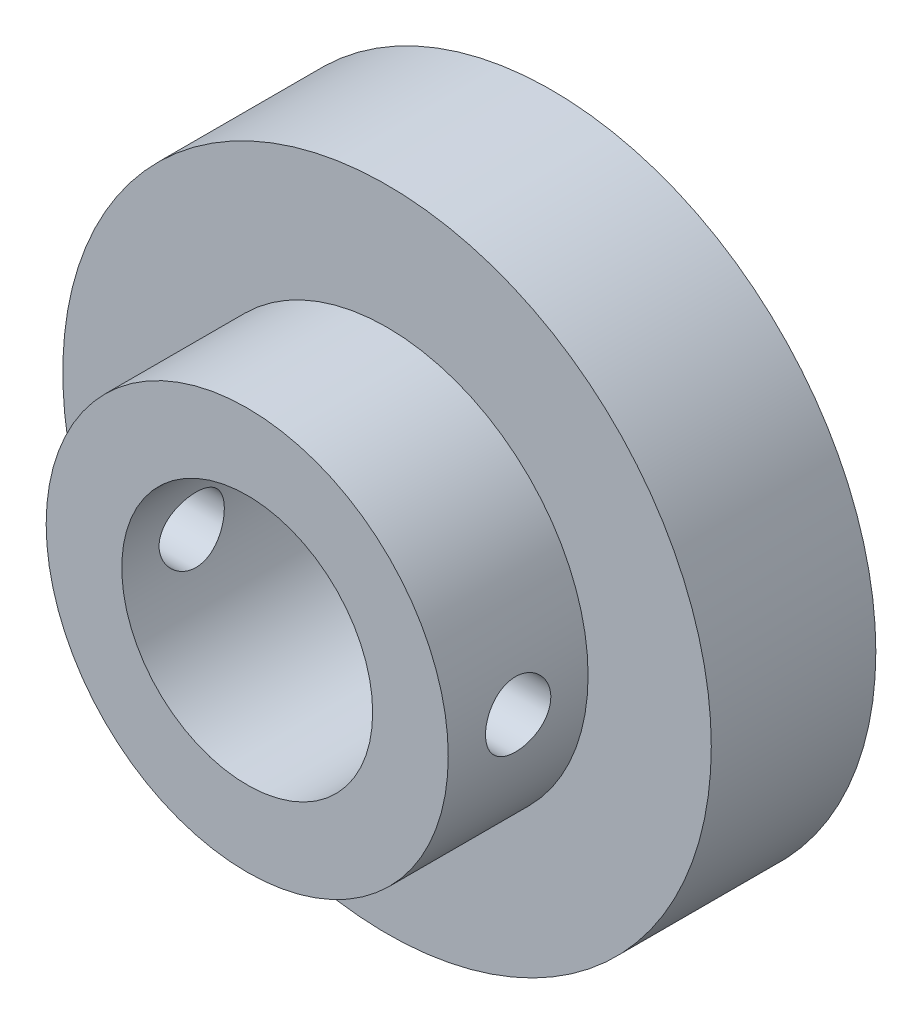
ISO-10303-21;
HEADER;
FILE_DESCRIPTION(('STEP AP214'),'2;1');
FILE_NAME('part.step','',(''),(''),'','','');
FILE_SCHEMA(('AUTOMOTIVE_DESIGN { 1 0 10303 214 1 1 1 1 }'));
ENDSEC;
DATA;
#1=APPLICATION_CONTEXT('core data for automotive mechanical design processes');
#2=APPLICATION_PROTOCOL_DEFINITION('international standard','automotive_design',2000,#1);
#3=PRODUCT_CONTEXT('',#1,'mechanical');
#4=PRODUCT('Part','Part','',(#3));
#5=PRODUCT_RELATED_PRODUCT_CATEGORY('part','',(#4));
#6=PRODUCT_DEFINITION_FORMATION('','',#4);
#7=PRODUCT_DEFINITION_CONTEXT('part definition',#1,'design');
#8=PRODUCT_DEFINITION('design','',#6,#7);
#9=PRODUCT_DEFINITION_SHAPE('','',#8);
#10=(LENGTH_UNIT() NAMED_UNIT(*) SI_UNIT(.MILLI.,.METRE.));
#11=(NAMED_UNIT(*) PLANE_ANGLE_UNIT() SI_UNIT($,.RADIAN.));
#12=(NAMED_UNIT(*) SI_UNIT($,.STERADIAN.) SOLID_ANGLE_UNIT());
#13=UNCERTAINTY_MEASURE_WITH_UNIT(LENGTH_MEASURE(1.E-05),#10,'distance_accuracy_value','');
#14=(GEOMETRIC_REPRESENTATION_CONTEXT(3) GLOBAL_UNCERTAINTY_ASSIGNED_CONTEXT((#13)) GLOBAL_UNIT_ASSIGNED_CONTEXT((#10,
#11,#12)) REPRESENTATION_CONTEXT('',''));
#15=CARTESIAN_POINT('',(0.,0.,0.));
#16=DIRECTION('',(0.,0.,1.));
#17=DIRECTION('',(1.,0.,0.));
#18=AXIS2_PLACEMENT_3D('',#15,#16,#17);
#19=CARTESIAN_POINT('',(0.,0.,10.59));
#20=DIRECTION('',(0.,0.,-1.));
#21=DIRECTION('',(-1.,0.,0.));
#22=AXIS2_PLACEMENT_3D('',#19,#20,#21);
#23=CYLINDRICAL_SURFACE('',#22,20.87);
#24=CARTESIAN_POINT('',(0.,0.,10.59));
#25=DIRECTION('',(0.,0.,1.));
#26=DIRECTION('',(1.,0.,0.));
#27=AXIS2_PLACEMENT_3D('',#24,#25,#26);
#28=CIRCLE('',#27,20.87);
#29=CARTESIAN_POINT('',(20.87,0.,10.59));
#30=VERTEX_POINT('',#29);
#31=EDGE_CURVE('E56',#30,#30,#28,.T.);
#32=ORIENTED_EDGE('',*,*,#31,.F.);
#33=EDGE_LOOP('',(#32));
#34=FACE_BOUND('',#33,.T.);
#35=CARTESIAN_POINT('',(0.,0.,0.));
#36=DIRECTION('',(0.,0.,1.));
#37=DIRECTION('',(1.,0.,0.));
#38=AXIS2_PLACEMENT_3D('',#35,#36,#37);
#39=CIRCLE('',#38,20.87);
#40=CARTESIAN_POINT('',(20.87,0.,0.));
#41=VERTEX_POINT('',#40);
#42=EDGE_CURVE('E62',#41,#41,#39,.T.);
#43=ORIENTED_EDGE('',*,*,#42,.T.);
#44=EDGE_LOOP('',(#43));
#45=FACE_BOUND('',#44,.T.);
#46=ADVANCED_FACE('F43',(#34,#45),#23,.T.);
#47=CARTESIAN_POINT('',(0.,0.,10.59));
#48=DIRECTION('',(0.,0.,1.));
#49=DIRECTION('',(1.,0.,0.));
#50=AXIS2_PLACEMENT_3D('',#47,#48,#49);
#51=PLANE('',#50);
#52=CARTESIAN_POINT('',(0.,0.,10.59));
#53=DIRECTION('',(0.,0.,1.));
#54=DIRECTION('',(1.,0.,0.));
#55=AXIS2_PLACEMENT_3D('',#52,#53,#54);
#56=CIRCLE('',#55,12.94);
#57=CARTESIAN_POINT('',(12.94,0.,10.59));
#58=VERTEX_POINT('',#57);
#59=EDGE_CURVE('E10',#58,#58,#56,.T.);
#60=ORIENTED_EDGE('',*,*,#59,.F.);
#61=EDGE_LOOP('',(#60));
#62=FACE_BOUND('',#61,.T.);
#63=ORIENTED_EDGE('',*,*,#31,.T.);
#64=EDGE_LOOP('',(#63));
#65=FACE_BOUND('',#64,.T.);
#66=ADVANCED_FACE('F112',(#62,#65),#51,.T.);
#67=CARTESIAN_POINT('',(0.,0.,0.));
#68=DIRECTION('',(0.,0.,1.));
#69=DIRECTION('',(1.,0.,0.));
#70=AXIS2_PLACEMENT_3D('',#67,#68,#69);
#71=PLANE('',#70);
#72=CARTESIAN_POINT('',(0.,0.,0.));
#73=DIRECTION('',(0.,0.,1.));
#74=DIRECTION('',(1.,0.,0.));
#75=AXIS2_PLACEMENT_3D('',#72,#73,#74);
#76=CIRCLE('',#75,8.075);
#77=CARTESIAN_POINT('',(8.075,0.,0.));
#78=VERTEX_POINT('',#77);
#79=EDGE_CURVE('E74',#78,#78,#76,.T.);
#80=ORIENTED_EDGE('',*,*,#79,.T.);
#81=EDGE_LOOP('',(#80));
#82=FACE_BOUND('',#81,.T.);
#83=ORIENTED_EDGE('',*,*,#42,.F.);
#84=EDGE_LOOP('',(#83));
#85=FACE_BOUND('',#84,.T.);
#86=ADVANCED_FACE('F110',(#82,#85),#71,.F.);
#87=CARTESIAN_POINT('',(0.,0.,19.59));
#88=DIRECTION('',(0.,0.,-1.));
#89=DIRECTION('',(-1.,0.,0.));
#90=AXIS2_PLACEMENT_3D('',#87,#88,#89);
#91=CYLINDRICAL_SURFACE('',#90,12.94);
#92=CARTESIAN_POINT('',(-12.94,0.,17.19));
#93=CARTESIAN_POINT('',(-12.9399980241754,-0.117133004778793,17.189995264999));
#94=CARTESIAN_POINT('',(-12.9383929722534,-0.234331039595752,17.1801667992868));
#95=CARTESIAN_POINT('',(-12.9321446370873,-0.465443115999579,17.1411272216284));
#96=CARTESIAN_POINT('',(-12.9274985151994,-0.579353985402283,17.1118979999609));
#97=CARTESIAN_POINT('',(-12.9156894358132,-0.800514316461485,17.0349601376974));
#98=CARTESIAN_POINT('',(-12.9085284950729,-0.907769035152397,16.9872663016627));
#99=CARTESIAN_POINT('',(-12.8924782098801,-1.11273907116277,16.8747911383677));
#100=CARTESIAN_POINT('',(-12.8835890746247,-1.21045554093364,16.8100118789502));
#101=CARTESIAN_POINT('',(-12.864978363956,-1.39447740252994,16.6645784214341));
#102=CARTESIAN_POINT('',(-12.8552506088143,-1.48068357233687,16.5837994518265));
#103=CARTESIAN_POINT('',(-12.8361066257887,-1.63838094388958,16.4089281467413));
#104=CARTESIAN_POINT('',(-12.8266904171094,-1.70987123991715,16.3148349924163));
#105=CARTESIAN_POINT('',(-12.8091757961874,-1.83650209178063,16.115328699782));
#106=CARTESIAN_POINT('',(-12.8010853699035,-1.89154510146963,16.009852884709));
#107=CARTESIAN_POINT('',(-12.7872237240288,-1.98309523426999,15.7909994432214));
#108=CARTESIAN_POINT('',(-12.7814523561055,-2.01960354294466,15.6776223227377));
#109=CARTESIAN_POINT('',(-12.7729436015328,-2.07273651696627,15.4472342336656));
#110=CARTESIAN_POINT('',(-12.7701801497652,-2.08953210428434,15.3302636644239));
#111=CARTESIAN_POINT('',(-12.7679211939708,-2.10329269462197,15.0951343916371));
#112=CARTESIAN_POINT('',(-12.7684254706247,-2.10025902851632,14.9769757683618));
#113=CARTESIAN_POINT('',(-12.7726211865325,-2.07458657261038,14.7440411275668));
#114=CARTESIAN_POINT('',(-12.7762814837238,-2.05213933980088,14.6292433555921));
#115=CARTESIAN_POINT('',(-12.7863280972952,-1.98857735786101,14.4050653381095));
#116=CARTESIAN_POINT('',(-12.7927145027339,-1.94746199886199,14.295685269722));
#117=CARTESIAN_POINT('',(-12.8075275939851,-1.84753530331627,14.0848715477765));
#118=CARTESIAN_POINT('',(-12.8159634666115,-1.78864398881776,13.9834764761779));
#119=CARTESIAN_POINT('',(-12.8339185344896,-1.65489392102395,13.7919348555006));
#120=CARTESIAN_POINT('',(-12.8434378127111,-1.58003394442559,13.7017891690369));
#121=CARTESIAN_POINT('',(-12.8626241550442,-1.41542573133163,13.5341960246369));
#122=CARTESIAN_POINT('',(-12.8722916422761,-1.32551304753351,13.4569100424071));
#123=CARTESIAN_POINT('',(-12.8905817017348,-1.1339090523248,13.3184985085741));
#124=CARTESIAN_POINT('',(-12.8992042678604,-1.03221767214673,13.2573730513276));
#125=CARTESIAN_POINT('',(-12.9144442829272,-0.819794336972503,13.153004749562));
#126=CARTESIAN_POINT('',(-12.9210601866165,-0.709055497755941,13.1097756770449));
#127=CARTESIAN_POINT('',(-12.9315289080157,-0.481758135091343,13.0425745253392));
#128=CARTESIAN_POINT('',(-12.9353819447421,-0.365200073725384,13.018600919723));
#129=CARTESIAN_POINT('',(-12.9398614700387,-0.130965202322276,12.9908089840302));
#130=CARTESIAN_POINT('',(-12.940523457129,-0.0133153589305277,12.9867688935482));
#131=CARTESIAN_POINT('',(-12.9386433600402,0.22098059239502,12.9983681586461));
#132=CARTESIAN_POINT('',(-12.9361013925404,0.33762673672501,13.0140067975811));
#133=CARTESIAN_POINT('',(-12.9281209736254,0.565922771244214,13.0643351578607));
#134=CARTESIAN_POINT('',(-12.9226991473034,0.677597391024365,13.0989155660058));
#135=CARTESIAN_POINT('',(-12.9095646260904,0.893564072852798,13.1860296648497));
#136=CARTESIAN_POINT('',(-12.9018518081518,0.997855737995067,13.2385643198815));
#137=CARTESIAN_POINT('',(-12.884903215117,1.19706254963206,13.360606911255));
#138=CARTESIAN_POINT('',(-12.8756551704965,1.29189140758515,13.4302539576811));
#139=CARTESIAN_POINT('',(-12.8567002877048,1.46859452431827,13.5843523195716));
#140=CARTESIAN_POINT('',(-12.8469934180735,1.55046789310391,13.6688046512651));
#141=CARTESIAN_POINT('',(-12.8281007272734,1.69975386288309,13.8511089169434));
#142=CARTESIAN_POINT('',(-12.8189209419045,1.76701694673022,13.949084011271));
#143=CARTESIAN_POINT('',(-12.8022329176678,1.88413012200222,14.1550727666687));
#144=CARTESIAN_POINT('',(-12.7947246278497,1.93398074421829,14.2630861216114));
#145=CARTESIAN_POINT('',(-12.7822745764015,2.01462807907936,14.4856596750184));
#146=CARTESIAN_POINT('',(-12.7773226469574,2.04550037225886,14.6001918933279));
#147=CARTESIAN_POINT('',(-12.7705200655981,2.08755331338758,14.8329030042822));
#148=CARTESIAN_POINT('',(-12.7686691593594,2.09873557617533,14.9510815970679));
#149=CARTESIAN_POINT('',(-12.7682887584011,2.10104779295338,15.1862385501354));
#150=CARTESIAN_POINT('',(-12.7697202937463,2.09241301846941,15.3032146009948));
#151=CARTESIAN_POINT('',(-12.7756582650499,2.05584376184161,15.5340263628907));
#152=CARTESIAN_POINT('',(-12.7801646924999,2.02790933310093,15.6478620826158));
#153=CARTESIAN_POINT('',(-12.7917301988748,1.95362199158984,15.8690778270295));
#154=CARTESIAN_POINT('',(-12.7987866130025,1.90728830150853,15.9764644550541));
#155=CARTESIAN_POINT('',(-12.8146597633533,1.79754161935376,16.1819781793584));
#156=CARTESIAN_POINT('',(-12.8234765794171,1.73412785259065,16.2801048553679));
#157=CARTESIAN_POINT('',(-12.8420011302967,1.59117728489368,16.4655037389089));
#158=CARTESIAN_POINT('',(-12.8517177748315,1.5114670670328,16.5526413624274));
#159=CARTESIAN_POINT('',(-12.8708752011946,1.33855233333814,16.7123852853788));
#160=CARTESIAN_POINT('',(-12.8803159187362,1.24534470246074,16.7849882211368));
#161=CARTESIAN_POINT('',(-12.8979288070116,1.04736093996648,16.914031737696));
#162=CARTESIAN_POINT('',(-12.9060923123139,0.942513394775595,16.9703639374369));
#163=CARTESIAN_POINT('',(-12.9201465303463,0.724756032285155,17.0645307045868));
#164=CARTESIAN_POINT('',(-12.9260395301343,0.611854464339938,17.102383896039));
#165=CARTESIAN_POINT('',(-12.9335865551076,0.415412643898881,17.1502003282046));
#166=CARTESIAN_POINT('',(-12.9359788799252,0.333067652544799,17.1651016034933));
#167=CARTESIAN_POINT('',(-12.9391862949518,0.167159468923981,17.1850030507038));
#168=CARTESIAN_POINT('',(-12.9400014101202,0.0835962959560972,17.1900033793084));
#169=CARTESIAN_POINT('',(-12.94,0.,17.19));
#170=B_SPLINE_CURVE_WITH_KNOTS('',3,(#92,#93,#94,#95,#96,#97,#98,#99,#100,#101,#102,#103,#104,
#105,#106,#107,#108,#109,#110,#111,#112,#113,#114,#115,#116,#117,#118,#119,#120,#121,#122,#123,
#124,#125,#126,#127,#128,#129,#130,#131,#132,#133,#134,#135,#136,#137,#138,#139,#140,#141,#142,
#143,#144,#145,#146,#147,#148,#149,#150,#151,#152,#153,#154,#155,#156,#157,#158,#159,#160,#161,
#162,#163,#164,#165,#166,#167,#168,#169),.UNSPECIFIED.,.T.,.F.,(4,2,2,2,2,2,2,2,2,2,2,2,2,2,2,2,
2,2,2,2,2,2,2,2,2,2,2,2,2,2,2,2,2,2,2,2,2,2,4),(0.,0.351093472911228,0.702515137343853,
1.05365562044774,1.40475362462734,1.75870581788743,2.11267978934147,2.4687132529443,
2.82472394016621,3.17762443121232,3.53050123697217,3.87993536475182,4.22938090900968,
4.58042273393296,4.93149146060019,5.28668111656457,5.64187284633499,5.99733740489108,
6.35277378212674,6.70424687090307,7.05570716037294,7.40516021616641,7.75463204423486,
8.10704467812442,8.45948151096362,8.81537087566218,9.17124939069218,9.52570129150246,
9.88012412129371,10.2303609771512,10.5805968638889,10.9304677991738,11.2803546059946,
11.6341790345009,11.9880852520369,12.3442972031226,12.7001494014687,12.9507241937992,
13.2012950207422),.UNSPECIFIED.);
#171=CARTESIAN_POINT('',(-12.94,0.,17.19));
#172=VERTEX_POINT('',#171);
#173=EDGE_CURVE('E101',#172,#172,#170,.T.);
#174=ORIENTED_EDGE('',*,*,#173,.T.);
#175=EDGE_LOOP('',(#174));
#176=FACE_BOUND('',#175,.T.);
#177=CARTESIAN_POINT('',(12.94,0.,12.99));
#178=CARTESIAN_POINT('',(12.9399980241754,-0.117133004778793,12.990004735001));
#179=CARTESIAN_POINT('',(12.9383929722534,-0.234331039595752,12.9998332007132));
#180=CARTESIAN_POINT('',(12.9321446370873,-0.465443115999579,13.0388727783716));
#181=CARTESIAN_POINT('',(12.9274985151994,-0.579353985402283,13.0681020000391));
#182=CARTESIAN_POINT('',(12.9156894358132,-0.800514316461485,13.1450398623026));
#183=CARTESIAN_POINT('',(12.9085284950729,-0.907769035152396,13.1927336983373));
#184=CARTESIAN_POINT('',(12.8924782098801,-1.11273907116277,13.3052088616323));
#185=CARTESIAN_POINT('',(12.8835890746247,-1.21045554093364,13.3699881210498));
#186=CARTESIAN_POINT('',(12.864978363956,-1.39447740252994,13.5154215785659));
#187=CARTESIAN_POINT('',(12.8552506088143,-1.48068357233687,13.5962005481735));
#188=CARTESIAN_POINT('',(12.8361066257887,-1.63838094388958,13.7710718532587));
#189=CARTESIAN_POINT('',(12.8266904171094,-1.70987123991715,13.8651650075837));
#190=CARTESIAN_POINT('',(12.8091757961874,-1.83650209178062,14.064671300218));
#191=CARTESIAN_POINT('',(12.8010853699035,-1.89154510146963,14.170147115291));
#192=CARTESIAN_POINT('',(12.7872237240288,-1.98309523426999,14.3890005567786));
#193=CARTESIAN_POINT('',(12.7814523561055,-2.01960354294466,14.5023776772623));
#194=CARTESIAN_POINT('',(12.7729436015328,-2.07273651696627,14.7327657663344));
#195=CARTESIAN_POINT('',(12.7701801497652,-2.08953210428434,14.8497363355761));
#196=CARTESIAN_POINT('',(12.7679211939708,-2.10329269462197,15.0848656083629));
#197=CARTESIAN_POINT('',(12.7684254706247,-2.10025902851632,15.2030242316382));
#198=CARTESIAN_POINT('',(12.7726211865325,-2.07458657261038,15.4359588724332));
#199=CARTESIAN_POINT('',(12.7762814837238,-2.05213933980089,15.5507566444079));
#200=CARTESIAN_POINT('',(12.7863280972952,-1.98857735786102,15.7749346618905));
#201=CARTESIAN_POINT('',(12.7927145027339,-1.94746199886199,15.884314730278));
#202=CARTESIAN_POINT('',(12.8075275939851,-1.84753530331628,16.0951284522234));
#203=CARTESIAN_POINT('',(12.8159634666115,-1.78864398881776,16.1965235238221));
#204=CARTESIAN_POINT('',(12.8339185344896,-1.65489392102395,16.3880651444994));
#205=CARTESIAN_POINT('',(12.8434378127111,-1.58003394442559,16.4782108309631));
#206=CARTESIAN_POINT('',(12.8626241550442,-1.41542573133163,16.6458039753631));
#207=CARTESIAN_POINT('',(12.8722916422761,-1.32551304753351,16.7230899575928));
#208=CARTESIAN_POINT('',(12.8905817017348,-1.1339090523248,16.8615014914259));
#209=CARTESIAN_POINT('',(12.8992042678604,-1.03221767214673,16.9226269486724));
#210=CARTESIAN_POINT('',(12.9144442829272,-0.819794336972504,17.026995250438));
#211=CARTESIAN_POINT('',(12.9210601866165,-0.709055497755942,17.0702243229551));
#212=CARTESIAN_POINT('',(12.9315289080157,-0.481758135091345,17.1374254746608));
#213=CARTESIAN_POINT('',(12.9353819447421,-0.365200073725385,17.161399080277));
#214=CARTESIAN_POINT('',(12.9398614700387,-0.130965202322276,17.1891910159698));
#215=CARTESIAN_POINT('',(12.940523457129,-0.0133153589305276,17.1932311064518));
#216=CARTESIAN_POINT('',(12.9386433600402,0.220980592395021,17.1816318413539));
#217=CARTESIAN_POINT('',(12.9361013925404,0.33762673672501,17.1659932024188));
#218=CARTESIAN_POINT('',(12.9281209736254,0.565922771244214,17.1156648421393));
#219=CARTESIAN_POINT('',(12.9226991473034,0.677597391024365,17.0810844339942));
#220=CARTESIAN_POINT('',(12.9095646260904,0.893564072852799,16.9939703351503));
#221=CARTESIAN_POINT('',(12.9018518081518,0.997855737995067,16.9414356801185));
#222=CARTESIAN_POINT('',(12.884903215117,1.19706254963206,16.819393088745));
#223=CARTESIAN_POINT('',(12.8756551704965,1.29189140758515,16.7497460423189));
#224=CARTESIAN_POINT('',(12.8567002877048,1.46859452431827,16.5956476804284));
#225=CARTESIAN_POINT('',(12.8469934180735,1.55046789310392,16.5111953487349));
#226=CARTESIAN_POINT('',(12.8281007272734,1.69975386288309,16.3288910830566));
#227=CARTESIAN_POINT('',(12.8189209419045,1.76701694673022,16.230915988729));
#228=CARTESIAN_POINT('',(12.8022329176678,1.88413012200222,16.0249272333313));
#229=CARTESIAN_POINT('',(12.7947246278497,1.93398074421829,15.9169138783886));
#230=CARTESIAN_POINT('',(12.7822745764015,2.01462807907936,15.6943403249816));
#231=CARTESIAN_POINT('',(12.7773226469574,2.04550037225886,15.5798081066721));
#232=CARTESIAN_POINT('',(12.7705200655981,2.08755331338758,15.3470969957178));
#233=CARTESIAN_POINT('',(12.7686691593594,2.09873557617533,15.2289184029321));
#234=CARTESIAN_POINT('',(12.7682887584011,2.10104779295338,14.9937614498646));
#235=CARTESIAN_POINT('',(12.7697202937463,2.09241301846941,14.8767853990052));
#236=CARTESIAN_POINT('',(12.7756582650499,2.05584376184161,14.6459736371092));
#237=CARTESIAN_POINT('',(12.7801646924999,2.02790933310093,14.5321379173842));
#238=CARTESIAN_POINT('',(12.7917301988748,1.95362199158984,14.3109221729705));
#239=CARTESIAN_POINT('',(12.7987866130025,1.90728830150853,14.2035355449459));
#240=CARTESIAN_POINT('',(12.8146597633533,1.79754161935376,13.9980218206416));
#241=CARTESIAN_POINT('',(12.8234765794171,1.73412785259065,13.8998951446321));
#242=CARTESIAN_POINT('',(12.8420011302967,1.59117728489368,13.7144962610911));
#243=CARTESIAN_POINT('',(12.8517177748315,1.5114670670328,13.6273586375726));
#244=CARTESIAN_POINT('',(12.8708752011946,1.33855233333814,13.4676147146212));
#245=CARTESIAN_POINT('',(12.8803159187362,1.24534470246074,13.3950117788632));
#246=CARTESIAN_POINT('',(12.8979288070116,1.04736093996648,13.265968262304));
#247=CARTESIAN_POINT('',(12.9060923123139,0.942513394775594,13.2096360625631));
#248=CARTESIAN_POINT('',(12.9201465303463,0.724756032285156,13.1154692954132));
#249=CARTESIAN_POINT('',(12.9260395301343,0.61185446433994,13.077616103961));
#250=CARTESIAN_POINT('',(12.9335865551076,0.415412643898883,13.0297996717954));
#251=CARTESIAN_POINT('',(12.9359788799252,0.3330676525448,13.0148983965067));
#252=CARTESIAN_POINT('',(12.9391862949518,0.167159468923981,12.9949969492963));
#253=CARTESIAN_POINT('',(12.9400014101202,0.0835962959560971,12.9899966206916));
#254=CARTESIAN_POINT('',(12.94,0.,12.99));
#255=B_SPLINE_CURVE_WITH_KNOTS('',3,(#177,#178,#179,#180,#181,#182,#183,#184,#185,#186,#187,
#188,#189,#190,#191,#192,#193,#194,#195,#196,#197,#198,#199,#200,#201,#202,#203,#204,#205,#206,
#207,#208,#209,#210,#211,#212,#213,#214,#215,#216,#217,#218,#219,#220,#221,#222,#223,#224,#225,
#226,#227,#228,#229,#230,#231,#232,#233,#234,#235,#236,#237,#238,#239,#240,#241,#242,#243,#244,
#245,#246,#247,#248,#249,#250,#251,#252,#253,#254),.UNSPECIFIED.,.T.,.F.,(4,2,2,2,2,2,2,2,2,2,2,
2,2,2,2,2,2,2,2,2,2,2,2,2,2,2,2,2,2,2,2,2,2,2,2,2,2,2,4),(0.,0.351093472911229,
0.702515137343853,1.05365562044774,1.40475362462735,1.75870581788742,2.11267978934147,
2.4687132529443,2.82472394016621,3.17762443121232,3.53050123697217,3.87993536475181,
4.22938090900968,4.58042273393295,4.93149146060018,5.28668111656457,5.64187284633499,
5.99733740489108,6.35277378212674,6.70424687090307,7.05570716037294,7.40516021616642,
7.75463204423486,8.10704467812442,8.45948151096363,8.81537087566218,9.17124939069218,
9.52570129150246,9.88012412129371,10.2303609771512,10.5805968638889,10.9304677991738,
11.2803546059946,11.6341790345009,11.9880852520369,12.3442972031226,12.7001494014687,
12.9507241937992,13.2012950207422),.UNSPECIFIED.);
#256=CARTESIAN_POINT('',(12.94,0.,12.99));
#257=VERTEX_POINT('',#256);
#258=EDGE_CURVE('E94',#257,#257,#255,.T.);
#259=ORIENTED_EDGE('',*,*,#258,.T.);
#260=EDGE_LOOP('',(#259));
#261=FACE_BOUND('',#260,.T.);
#262=CARTESIAN_POINT('',(0.,0.,19.59));
#263=DIRECTION('',(0.,0.,1.));
#264=DIRECTION('',(1.,0.,0.));
#265=AXIS2_PLACEMENT_3D('',#262,#263,#264);
#266=CIRCLE('',#265,12.94);
#267=CARTESIAN_POINT('',(12.94,0.,19.59));
#268=VERTEX_POINT('',#267);
#269=EDGE_CURVE('E65',#268,#268,#266,.T.);
#270=ORIENTED_EDGE('',*,*,#269,.F.);
#271=EDGE_LOOP('',(#270));
#272=FACE_BOUND('',#271,.T.);
#273=ORIENTED_EDGE('',*,*,#59,.T.);
#274=EDGE_LOOP('',(#273));
#275=FACE_BOUND('',#274,.T.);
#276=ADVANCED_FACE('F105',(#176,#261,#272,#275),#91,.T.);
#277=CARTESIAN_POINT('',(0.,0.,19.59));
#278=DIRECTION('',(0.,0.,1.));
#279=DIRECTION('',(1.,0.,0.));
#280=AXIS2_PLACEMENT_3D('',#277,#278,#279);
#281=PLANE('',#280);
#282=CARTESIAN_POINT('',(0.,0.,19.59));
#283=DIRECTION('',(0.,0.,1.));
#284=DIRECTION('',(1.,0.,0.));
#285=AXIS2_PLACEMENT_3D('',#282,#283,#284);
#286=CIRCLE('',#285,8.075);
#287=CARTESIAN_POINT('',(8.075,0.,19.59));
#288=VERTEX_POINT('',#287);
#289=EDGE_CURVE('E71',#288,#288,#286,.T.);
#290=ORIENTED_EDGE('',*,*,#289,.F.);
#291=EDGE_LOOP('',(#290));
#292=FACE_BOUND('',#291,.T.);
#293=ORIENTED_EDGE('',*,*,#269,.T.);
#294=EDGE_LOOP('',(#293));
#295=FACE_BOUND('',#294,.T.);
#296=ADVANCED_FACE('F109',(#292,#295),#281,.T.);
#297=CARTESIAN_POINT('',(0.,0.,0.));
#298=DIRECTION('',(0.,0.,1.));
#299=DIRECTION('',(1.,0.,0.));
#300=AXIS2_PLACEMENT_3D('',#297,#298,#299);
#301=CYLINDRICAL_SURFACE('',#300,8.075);
#302=CARTESIAN_POINT('',(8.075,0.,12.99));
#303=CARTESIAN_POINT('',(8.07499815788605,0.115871827424154,12.9900029609161));
#304=CARTESIAN_POINT('',(8.07248128670506,0.231775906926112,12.9996223987769));
#305=CARTESIAN_POINT('',(8.06268519251354,0.460252064256596,13.0377821225531));
#306=CARTESIAN_POINT('',(8.05540351377743,0.572822392621185,13.0663321651799));
#307=CARTESIAN_POINT('',(8.03688257153905,0.791299503739306,13.1413673084332));
#308=CARTESIAN_POINT('',(8.02564827181474,0.89721444873294,13.1878299210834));
#309=CARTESIAN_POINT('',(8.00041304967934,1.09974787488678,13.2972896371932));
#310=CARTESIAN_POINT('',(7.98641197915889,1.19636585795492,13.3602876258753));
#311=CARTESIAN_POINT('',(7.95681154209011,1.3797023703087,13.5025030527721));
#312=CARTESIAN_POINT('',(7.94118591687267,1.46618567650681,13.5820182725573));
#313=CARTESIAN_POINT('',(7.91026841980203,1.62475195125285,13.7543740572709));
#314=CARTESIAN_POINT('',(7.89497658892928,1.6968331603921,13.8472162478891));
#315=CARTESIAN_POINT('',(7.8661910558391,1.82567958964906,14.0454474374498));
#316=CARTESIAN_POINT('',(7.85273056788817,1.88217722434653,14.1510156259506));
#317=CARTESIAN_POINT('',(7.82951659403045,1.97653032740086,14.3705586047349));
#318=CARTESIAN_POINT('',(7.81976246163737,2.01438904721761,14.4845319247964));
#319=CARTESIAN_POINT('',(7.80533621431595,2.06957855821683,14.7150521951087));
#320=CARTESIAN_POINT('',(7.80055904612993,2.08733441059276,14.8314906487245));
#321=CARTESIAN_POINT('',(7.79631351135099,2.10313888292929,15.0657840817088));
#322=CARTESIAN_POINT('',(7.79684420503206,2.10119099132225,15.1836388066445));
#323=CARTESIAN_POINT('',(7.80306024129093,2.07798140194552,15.4141259974585));
#324=CARTESIAN_POINT('',(7.80860915531351,2.05723085616647,15.5268141955866));
#325=CARTESIAN_POINT('',(7.82401837736178,1.99782234336147,15.7470521351259));
#326=CARTESIAN_POINT('',(7.83387901490178,1.95916300768083,15.8546014831144));
#327=CARTESIAN_POINT('',(7.85692271510677,1.86461013792829,16.0628565714915));
#328=CARTESIAN_POINT('',(7.87014053155793,1.80853486908354,16.1634757922668));
#329=CARTESIAN_POINT('',(7.89839021652879,1.68086881154182,16.3540575135025));
#330=CARTESIAN_POINT('',(7.9134224260272,1.60927510444815,16.4440180045545));
#331=CARTESIAN_POINT('',(7.94417768020489,1.44997710627676,16.6136526373033));
#332=CARTESIAN_POINT('',(7.95990770564848,1.3618427142753,16.6929221641741));
#333=CARTESIAN_POINT('',(7.98986800347974,1.17334067744892,16.8356365064087));
#334=CARTESIAN_POINT('',(8.00409822233179,1.0729725962178,16.8990807569992));
#335=CARTESIAN_POINT('',(8.02953613283629,0.862245588790801,17.0085097202083));
#336=CARTESIAN_POINT('',(8.0407316223874,0.75184864421095,17.0544242423421));
#337=CARTESIAN_POINT('',(8.05875025845912,0.524545957278583,17.1269276322354));
#338=CARTESIAN_POINT('',(8.06557431216582,0.407641570865595,17.1535205098903));
#339=CARTESIAN_POINT('',(8.07394518304003,0.174098088141373,17.1859974571368));
#340=CARTESIAN_POINT('',(8.07563223893502,0.0575404520394953,17.192431989432));
#341=CARTESIAN_POINT('',(8.07394070236264,-0.174987522588724,17.1859255687249));
#342=CARTESIAN_POINT('',(8.07056260602884,-0.290957917519187,17.172986513373));
#343=CARTESIAN_POINT('',(8.05921063279311,-0.517075671335545,17.1285526556103));
#344=CARTESIAN_POINT('',(8.05131217294138,-0.627286962720302,17.0973621700387));
#345=CARTESIAN_POINT('',(8.03181296842914,-0.840904336533512,17.0176618844783));
#346=CARTESIAN_POINT('',(8.02021183302305,-0.944309699338374,16.9691502565148));
#347=CARTESIAN_POINT('',(7.99426254301436,-1.1435395205331,16.8551453228003));
#348=CARTESIAN_POINT('',(7.97986670399213,-1.23918421109676,16.7893489840225));
#349=CARTESIAN_POINT('',(7.94999337305592,-1.41826906845428,16.6430258512016));
#350=CARTESIAN_POINT('',(7.93451567869047,-1.50170694185814,16.5624962954939));
#351=CARTESIAN_POINT('',(7.90371154527326,-1.65630879109929,16.3864287668293));
#352=CARTESIAN_POINT('',(7.88840019770937,-1.72708524550091,16.2905472690122));
#353=CARTESIAN_POINT('',(7.86011973232361,-1.85154857471353,16.0879476664049));
#354=CARTESIAN_POINT('',(7.847150513536,-1.90523618627563,15.9812300290548));
#355=CARTESIAN_POINT('',(7.825169762581,-1.99359403204249,15.7605393119808));
#356=CARTESIAN_POINT('',(7.81613505931003,-2.02837591526294,15.6466133641046));
#357=CARTESIAN_POINT('',(7.80303368957822,-2.0782123995793,15.4142568964385));
#358=CARTESIAN_POINT('',(7.79896582856905,-2.09327174409945,15.2958274668248));
#359=CARTESIAN_POINT('',(7.7963550192497,-2.10297275547962,15.0617833650943));
#360=CARTESIAN_POINT('',(7.79764391496779,-2.09823582825744,14.9461959298208));
#361=CARTESIAN_POINT('',(7.8052096728301,-2.06991243787169,14.717528919108));
#362=CARTESIAN_POINT('',(7.8114864183067,-2.04632641559525,14.6044492850739));
#363=CARTESIAN_POINT('',(7.82822308488921,-1.98132636088469,14.3847469125981));
#364=CARTESIAN_POINT('',(7.83865350384139,-1.94003790765334,14.2780846168434));
#365=CARTESIAN_POINT('',(7.86252431515174,-1.84090312666794,14.0731220934613));
#366=CARTESIAN_POINT('',(7.87596515806555,-1.78305432004485,13.974823120574));
#367=CARTESIAN_POINT('',(7.90481400022032,-1.65053155625944,13.7863965697801));
#368=CARTESIAN_POINT('',(7.92026664870569,-1.57543065640827,13.6965760584136));
#369=CARTESIAN_POINT('',(7.95114185174705,-1.41135561074052,13.5306104026646));
#370=CARTESIAN_POINT('',(7.96656439816537,-1.32237813043121,13.4544685547043));
#371=CARTESIAN_POINT('',(7.99601105142036,-1.13092336578401,13.3165261351406));
#372=CARTESIAN_POINT('',(8.01000093269915,-1.02821124385345,13.2550436027211));
#373=CARTESIAN_POINT('',(8.03463718970854,-0.813550841608094,13.1503156933943));
#374=CARTESIAN_POINT('',(8.04528581166144,-0.701608830458552,13.1070580577353));
#375=CARTESIAN_POINT('',(8.0605826159974,-0.491660634954398,13.0459662396319));
#376=CARTESIAN_POINT('',(8.06595065841885,-0.394599084716608,13.0250262604561));
#377=CARTESIAN_POINT('',(8.07315998246533,-0.198366109784046,12.997042489697));
#378=CARTESIAN_POINT('',(8.07500157698608,-0.0991948730677301,12.9899974652364));
#379=CARTESIAN_POINT('',(8.075,0.,12.99));
#380=B_SPLINE_CURVE_WITH_KNOTS('',3,(#302,#303,#304,#305,#306,#307,#308,#309,#310,#311,#312,
#313,#314,#315,#316,#317,#318,#319,#320,#321,#322,#323,#324,#325,#326,#327,#328,#329,#330,#331,
#332,#333,#334,#335,#336,#337,#338,#339,#340,#341,#342,#343,#344,#345,#346,#347,#348,#349,#350,
#351,#352,#353,#354,#355,#356,#357,#358,#359,#360,#361,#362,#363,#364,#365,#366,#367,#368,#369,
#370,#371,#372,#373,#374,#375,#376,#377,#378,#379),.UNSPECIFIED.,.T.,.F.,(4,2,2,2,2,2,2,2,2,2,2,
2,2,2,2,2,2,2,2,2,2,2,2,2,2,2,2,2,2,2,2,2,2,2,2,2,2,2,4),(0.,0.347251815022119,
0.694682740642506,1.04167890402442,1.38869364766054,1.74261303210576,2.09657562613492,
2.4562834299754,2.81592846244295,3.16781808133873,3.51964540133122,3.86218611257907,
4.20475300635029,4.55102201767935,4.89735620492654,5.25441115945376,5.6114788547516,
5.96996164750229,6.32837002167273,6.67690202685879,7.02539989543371,7.36824625795266,
7.71112881322446,8.06047845371332,8.40989364518772,8.76864503771845,9.12738096130822,
9.48397467023088,9.84048259982847,10.1858851668707,10.5312796550588,10.8742634690736,
11.2172986501637,11.5699689238689,11.9227240739293,12.2825496807864,12.642132867481,
12.9394325406784,13.2367058337591),.UNSPECIFIED.);
#381=CARTESIAN_POINT('',(8.075,0.,12.99));
#382=VERTEX_POINT('',#381);
#383=EDGE_CURVE('E46',#382,#382,#380,.T.);
#384=ORIENTED_EDGE('',*,*,#383,.T.);
#385=EDGE_LOOP('',(#384));
#386=FACE_BOUND('',#385,.T.);
#387=CARTESIAN_POINT('',(-8.075,0.,12.99));
#388=CARTESIAN_POINT('',(-8.07499815788605,-0.115871827424154,12.9900029609161));
#389=CARTESIAN_POINT('',(-8.07248128670506,-0.231775906926112,12.9996223987769));
#390=CARTESIAN_POINT('',(-8.06268519251354,-0.460252064256596,13.0377821225531));
#391=CARTESIAN_POINT('',(-8.05540351377743,-0.572822392621185,13.0663321651799));
#392=CARTESIAN_POINT('',(-8.03688257153905,-0.791299503739306,13.1413673084332));
#393=CARTESIAN_POINT('',(-8.02564827181474,-0.89721444873294,13.1878299210834));
#394=CARTESIAN_POINT('',(-8.00041304967934,-1.09974787488678,13.2972896371932));
#395=CARTESIAN_POINT('',(-7.98641197915889,-1.19636585795492,13.3602876258753));
#396=CARTESIAN_POINT('',(-7.95681154209011,-1.3797023703087,13.5025030527721));
#397=CARTESIAN_POINT('',(-7.94118591687267,-1.46618567650681,13.5820182725573));
#398=CARTESIAN_POINT('',(-7.91026841980203,-1.62475195125285,13.7543740572709));
#399=CARTESIAN_POINT('',(-7.89497658892928,-1.6968331603921,13.8472162478891));
#400=CARTESIAN_POINT('',(-7.8661910558391,-1.82567958964906,14.0454474374498));
#401=CARTESIAN_POINT('',(-7.85273056788817,-1.88217722434653,14.1510156259506));
#402=CARTESIAN_POINT('',(-7.82951659403045,-1.97653032740086,14.3705586047349));
#403=CARTESIAN_POINT('',(-7.81976246163737,-2.01438904721761,14.4845319247964));
#404=CARTESIAN_POINT('',(-7.80533621431595,-2.06957855821683,14.7150521951087));
#405=CARTESIAN_POINT('',(-7.80055904612993,-2.08733441059276,14.8314906487245));
#406=CARTESIAN_POINT('',(-7.79631351135099,-2.10313888292929,15.0657840817088));
#407=CARTESIAN_POINT('',(-7.79684420503206,-2.10119099132225,15.1836388066445));
#408=CARTESIAN_POINT('',(-7.80306024129093,-2.07798140194552,15.4141259974585));
#409=CARTESIAN_POINT('',(-7.80860915531351,-2.05723085616647,15.5268141955866));
#410=CARTESIAN_POINT('',(-7.82401837736178,-1.99782234336147,15.7470521351259));
#411=CARTESIAN_POINT('',(-7.83387901490178,-1.95916300768083,15.8546014831144));
#412=CARTESIAN_POINT('',(-7.85692271510677,-1.86461013792829,16.0628565714915));
#413=CARTESIAN_POINT('',(-7.87014053155793,-1.80853486908354,16.1634757922668));
#414=CARTESIAN_POINT('',(-7.89839021652879,-1.68086881154182,16.3540575135025));
#415=CARTESIAN_POINT('',(-7.9134224260272,-1.60927510444815,16.4440180045545));
#416=CARTESIAN_POINT('',(-7.94417768020489,-1.44997710627676,16.6136526373033));
#417=CARTESIAN_POINT('',(-7.95990770564848,-1.3618427142753,16.6929221641741));
#418=CARTESIAN_POINT('',(-7.98986800347974,-1.17334067744892,16.8356365064087));
#419=CARTESIAN_POINT('',(-8.00409822233179,-1.0729725962178,16.8990807569992));
#420=CARTESIAN_POINT('',(-8.02953613283629,-0.862245588790801,17.0085097202083));
#421=CARTESIAN_POINT('',(-8.0407316223874,-0.75184864421095,17.0544242423421));
#422=CARTESIAN_POINT('',(-8.05875025845912,-0.524545957278583,17.1269276322354));
#423=CARTESIAN_POINT('',(-8.06557431216582,-0.407641570865595,17.1535205098903));
#424=CARTESIAN_POINT('',(-8.07394518304003,-0.174098088141373,17.1859974571368));
#425=CARTESIAN_POINT('',(-8.07563223893502,-0.0575404520394953,17.192431989432));
#426=CARTESIAN_POINT('',(-8.07394070236264,0.174987522588724,17.1859255687249));
#427=CARTESIAN_POINT('',(-8.07056260602884,0.290957917519187,17.172986513373));
#428=CARTESIAN_POINT('',(-8.05921063279311,0.517075671335545,17.1285526556103));
#429=CARTESIAN_POINT('',(-8.05131217294138,0.627286962720302,17.0973621700387));
#430=CARTESIAN_POINT('',(-8.03181296842914,0.840904336533512,17.0176618844783));
#431=CARTESIAN_POINT('',(-8.02021183302305,0.944309699338374,16.9691502565148));
#432=CARTESIAN_POINT('',(-7.99426254301436,1.1435395205331,16.8551453228003));
#433=CARTESIAN_POINT('',(-7.97986670399213,1.23918421109676,16.7893489840225));
#434=CARTESIAN_POINT('',(-7.94999337305592,1.41826906845428,16.6430258512016));
#435=CARTESIAN_POINT('',(-7.93451567869047,1.50170694185814,16.5624962954939));
#436=CARTESIAN_POINT('',(-7.90371154527326,1.65630879109929,16.3864287668293));
#437=CARTESIAN_POINT('',(-7.88840019770937,1.72708524550091,16.2905472690122));
#438=CARTESIAN_POINT('',(-7.86011973232361,1.85154857471353,16.0879476664049));
#439=CARTESIAN_POINT('',(-7.847150513536,1.90523618627563,15.9812300290548));
#440=CARTESIAN_POINT('',(-7.825169762581,1.99359403204249,15.7605393119808));
#441=CARTESIAN_POINT('',(-7.81613505931003,2.02837591526294,15.6466133641046));
#442=CARTESIAN_POINT('',(-7.80303368957822,2.0782123995793,15.4142568964385));
#443=CARTESIAN_POINT('',(-7.79896582856905,2.09327174409945,15.2958274668248));
#444=CARTESIAN_POINT('',(-7.7963550192497,2.10297275547962,15.0617833650943));
#445=CARTESIAN_POINT('',(-7.79764391496779,2.09823582825744,14.9461959298208));
#446=CARTESIAN_POINT('',(-7.8052096728301,2.06991243787169,14.717528919108));
#447=CARTESIAN_POINT('',(-7.8114864183067,2.04632641559525,14.6044492850739));
#448=CARTESIAN_POINT('',(-7.82822308488921,1.98132636088469,14.3847469125981));
#449=CARTESIAN_POINT('',(-7.83865350384139,1.94003790765334,14.2780846168434));
#450=CARTESIAN_POINT('',(-7.86252431515174,1.84090312666794,14.0731220934613));
#451=CARTESIAN_POINT('',(-7.87596515806555,1.78305432004485,13.974823120574));
#452=CARTESIAN_POINT('',(-7.90481400022032,1.65053155625944,13.7863965697801));
#453=CARTESIAN_POINT('',(-7.92026664870569,1.57543065640827,13.6965760584136));
#454=CARTESIAN_POINT('',(-7.95114185174705,1.41135561074052,13.5306104026646));
#455=CARTESIAN_POINT('',(-7.96656439816537,1.32237813043121,13.4544685547043));
#456=CARTESIAN_POINT('',(-7.99601105142036,1.13092336578401,13.3165261351406));
#457=CARTESIAN_POINT('',(-8.01000093269915,1.02821124385345,13.2550436027211));
#458=CARTESIAN_POINT('',(-8.03463718970854,0.813550841608094,13.1503156933943));
#459=CARTESIAN_POINT('',(-8.04528581166144,0.701608830458552,13.1070580577353));
#460=CARTESIAN_POINT('',(-8.0605826159974,0.491660634954398,13.0459662396319));
#461=CARTESIAN_POINT('',(-8.06595065841885,0.394599084716608,13.0250262604561));
#462=CARTESIAN_POINT('',(-8.07315998246533,0.198366109784046,12.997042489697));
#463=CARTESIAN_POINT('',(-8.07500157698608,0.0991948730677301,12.9899974652364));
#464=CARTESIAN_POINT('',(-8.075,0.,12.99));
#465=B_SPLINE_CURVE_WITH_KNOTS('',3,(#387,#388,#389,#390,#391,#392,#393,#394,#395,#396,#397,
#398,#399,#400,#401,#402,#403,#404,#405,#406,#407,#408,#409,#410,#411,#412,#413,#414,#415,#416,
#417,#418,#419,#420,#421,#422,#423,#424,#425,#426,#427,#428,#429,#430,#431,#432,#433,#434,#435,
#436,#437,#438,#439,#440,#441,#442,#443,#444,#445,#446,#447,#448,#449,#450,#451,#452,#453,#454,
#455,#456,#457,#458,#459,#460,#461,#462,#463,#464),.UNSPECIFIED.,.T.,.F.,(4,2,2,2,2,2,2,2,2,2,2,
2,2,2,2,2,2,2,2,2,2,2,2,2,2,2,2,2,2,2,2,2,2,2,2,2,2,2,4),(0.,0.347251815022119,
0.694682740642506,1.04167890402442,1.38869364766054,1.74261303210576,2.09657562613492,
2.4562834299754,2.81592846244295,3.16781808133873,3.51964540133122,3.86218611257907,
4.20475300635029,4.55102201767935,4.89735620492654,5.25441115945376,5.6114788547516,
5.96996164750229,6.32837002167273,6.67690202685879,7.02539989543371,7.36824625795266,
7.71112881322446,8.06047845371332,8.40989364518772,8.76864503771845,9.12738096130822,
9.48397467023088,9.84048259982847,10.1858851668707,10.5312796550588,10.8742634690736,
11.2172986501637,11.5699689238689,11.9227240739293,12.2825496807864,12.642132867481,
12.9394325406784,13.2367058337591),.UNSPECIFIED.);
#466=CARTESIAN_POINT('',(-8.075,0.,12.99));
#467=VERTEX_POINT('',#466);
#468=EDGE_CURVE('E75',#467,#467,#465,.T.);
#469=ORIENTED_EDGE('',*,*,#468,.T.);
#470=EDGE_LOOP('',(#469));
#471=FACE_BOUND('',#470,.T.);
#472=ORIENTED_EDGE('',*,*,#289,.T.);
#473=EDGE_LOOP('',(#472));
#474=FACE_BOUND('',#473,.T.);
#475=ORIENTED_EDGE('',*,*,#79,.F.);
#476=EDGE_LOOP('',(#475));
#477=FACE_BOUND('',#476,.T.);
#478=ADVANCED_FACE('F81',(#386,#471,#474,#477),#301,.F.);
#479=CARTESIAN_POINT('',(-20.87,0.,15.09));
#480=DIRECTION('',(1.,0.,0.));
#481=DIRECTION('',(0.,0.,-1.));
#482=AXIS2_PLACEMENT_3D('',#479,#480,#481);
#483=CYLINDRICAL_SURFACE('',#482,2.1);
#484=ORIENTED_EDGE('',*,*,#468,.F.);
#485=EDGE_LOOP('',(#484));
#486=FACE_BOUND('',#485,.T.);
#487=ORIENTED_EDGE('',*,*,#173,.F.);
#488=EDGE_LOOP('',(#487));
#489=FACE_BOUND('',#488,.T.);
#490=ADVANCED_FACE('F84',(#486,#489),#483,.F.);
#491=ORIENTED_EDGE('',*,*,#383,.F.);
#492=EDGE_LOOP('',(#491));
#493=FACE_BOUND('',#492,.T.);
#494=ORIENTED_EDGE('',*,*,#258,.F.);
#495=EDGE_LOOP('',(#494));
#496=FACE_BOUND('',#495,.T.);
#497=ADVANCED_FACE('F87',(#493,#496),#483,.F.);
#498=CLOSED_SHELL('',(#46,#66,#86,#276,#296,#478,#490,#497));
#499=MANIFOLD_SOLID_BREP('B2',#498);
#500=ADVANCED_BREP_SHAPE_REPRESENTATION('',(#18,#499),#14);
#501=SHAPE_DEFINITION_REPRESENTATION(#9,#500);
ENDSEC;
END-ISO-10303-21;
